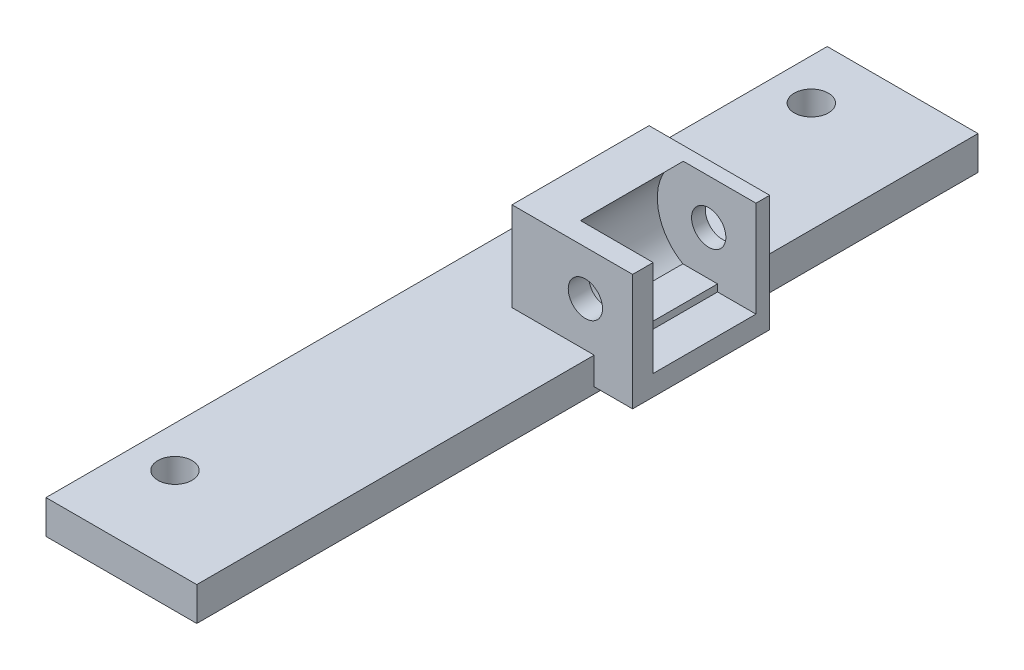
ISO-10303-21;
HEADER;
FILE_DESCRIPTION(('STEP AP214'),'2;1');
FILE_NAME('part.step','',(''),(''),'','','');
FILE_SCHEMA(('AUTOMOTIVE_DESIGN { 1 0 10303 214 1 1 1 1 }'));
ENDSEC;
DATA;
#1=APPLICATION_CONTEXT('core data for automotive mechanical design processes');
#2=APPLICATION_PROTOCOL_DEFINITION('international standard','automotive_design',2000,#1);
#3=PRODUCT_CONTEXT('',#1,'mechanical');
#4=PRODUCT('Part','Part','',(#3));
#5=PRODUCT_RELATED_PRODUCT_CATEGORY('part','',(#4));
#6=PRODUCT_DEFINITION_FORMATION('','',#4);
#7=PRODUCT_DEFINITION_CONTEXT('part definition',#1,'design');
#8=PRODUCT_DEFINITION('design','',#6,#7);
#9=PRODUCT_DEFINITION_SHAPE('','',#8);
#10=(LENGTH_UNIT() NAMED_UNIT(*) SI_UNIT(.MILLI.,.METRE.));
#11=(NAMED_UNIT(*) PLANE_ANGLE_UNIT() SI_UNIT($,.RADIAN.));
#12=(NAMED_UNIT(*) SI_UNIT($,.STERADIAN.) SOLID_ANGLE_UNIT());
#13=UNCERTAINTY_MEASURE_WITH_UNIT(LENGTH_MEASURE(1.E-05),#10,'distance_accuracy_value','');
#14=(GEOMETRIC_REPRESENTATION_CONTEXT(3) GLOBAL_UNCERTAINTY_ASSIGNED_CONTEXT((#13)) GLOBAL_UNIT_ASSIGNED_CONTEXT((#10,
#11,#12)) REPRESENTATION_CONTEXT('',''));
#15=CARTESIAN_POINT('',(0.,0.,0.));
#16=DIRECTION('',(0.,0.,1.));
#17=DIRECTION('',(1.,0.,0.));
#18=AXIS2_PLACEMENT_3D('',#15,#16,#17);
#19=CARTESIAN_POINT('',(-801.33832114316,105.685777143036,-21.59));
#20=DIRECTION('',(0.,0.,1.));
#21=DIRECTION('',(1.,0.,0.));
#22=AXIS2_PLACEMENT_3D('',#19,#20,#21);
#23=CYLINDRICAL_SURFACE('',#22,9.52500000000069);
#24=CARTESIAN_POINT('',(-801.33832114316,105.685777143036,0.));
#25=DIRECTION('',(0.,0.,1.));
#26=DIRECTION('',(1.,0.,0.));
#27=AXIS2_PLACEMENT_3D('',#24,#25,#26);
#28=CIRCLE('',#27,9.52500000000069);
#29=CARTESIAN_POINT('',(-806.134080607521,97.4561771430357,0.));
#30=VERTEX_POINT('',#29);
#31=CARTESIAN_POINT('',(-806.045825879217,113.966177143036,0.));
#32=VERTEX_POINT('',#31);
#33=EDGE_CURVE('E324',#30,#32,#28,.F.);
#34=ORIENTED_EDGE('',*,*,#33,.F.);
#35=DIRECTION('',(0.,0.,1.));
#36=VECTOR('',#35,1.);
#37=CARTESIAN_POINT('',(-806.134080607521,97.4561771430357,-21.59));
#38=LINE('',#37,#36);
#39=CARTESIAN_POINT('',(-806.134080607521,97.4561771430357,-19.05));
#40=VERTEX_POINT('',#39);
#41=EDGE_CURVE('E228',#30,#40,#38,.F.);
#42=ORIENTED_EDGE('',*,*,#41,.T.);
#43=CARTESIAN_POINT('',(-801.33832114316,105.685777143036,-19.05));
#44=DIRECTION('',(0.,0.,1.));
#45=DIRECTION('',(1.,0.,0.));
#46=AXIS2_PLACEMENT_3D('',#43,#44,#45);
#47=CIRCLE('',#46,9.52500000000069);
#48=CARTESIAN_POINT('',(-806.045825879217,113.966177143036,-19.05));
#49=VERTEX_POINT('',#48);
#50=EDGE_CURVE('E279',#49,#40,#47,.T.);
#51=ORIENTED_EDGE('',*,*,#50,.F.);
#52=DIRECTION('',(0.,0.,1.));
#53=VECTOR('',#52,1.);
#54=CARTESIAN_POINT('',(-806.045825879217,113.966177143036,-21.59));
#55=LINE('',#54,#53);
#56=EDGE_CURVE('E339',#49,#32,#55,.T.);
#57=ORIENTED_EDGE('',*,*,#56,.T.);
#58=EDGE_LOOP('',(#34,#42,#51,#57));
#59=FACE_BOUND('',#58,.T.);
#60=ADVANCED_FACE('F47',(#59),#23,.F.);
#61=CARTESIAN_POINT('',(-814.935825879218,0.,-21.59));
#62=DIRECTION('',(-1.,0.,0.));
#63=DIRECTION('',(0.,0.,1.));
#64=AXIS2_PLACEMENT_3D('',#61,#62,#63);
#65=PLANE('',#64);
#66=DIRECTION('',(0.,-1.,0.));
#67=VECTOR('',#66,1.);
#68=CARTESIAN_POINT('',(-814.935825879218,0.,-21.59));
#69=LINE('',#68,#67);
#70=CARTESIAN_POINT('',(-814.935825879218,113.966177143036,-21.59));
#71=VERTEX_POINT('',#70);
#72=CARTESIAN_POINT('',(-814.935825879218,97.4561771430357,-21.59));
#73=VERTEX_POINT('',#72);
#74=EDGE_CURVE('E328',#71,#73,#69,.T.);
#75=ORIENTED_EDGE('',*,*,#74,.T.);
#76=DIRECTION('',(0.,0.,1.));
#77=VECTOR('',#76,1.);
#78=CARTESIAN_POINT('',(-814.935825879218,97.4561771430357,-21.59));
#79=LINE('',#78,#77);
#80=CARTESIAN_POINT('',(-814.935825879218,97.4561771430357,3.81));
#81=VERTEX_POINT('',#80);
#82=EDGE_CURVE('E244',#73,#81,#79,.T.);
#83=ORIENTED_EDGE('',*,*,#82,.T.);
#84=DIRECTION('',(0.,-1.,0.));
#85=VECTOR('',#84,1.);
#86=CARTESIAN_POINT('',(-814.935825879218,92.3761771430357,3.81));
#87=LINE('',#86,#85);
#88=CARTESIAN_POINT('',(-814.935825879218,113.966177143036,3.81));
#89=VERTEX_POINT('',#88);
#90=EDGE_CURVE('E301',#89,#81,#87,.T.);
#91=ORIENTED_EDGE('',*,*,#90,.F.);
#92=DIRECTION('',(0.,0.,1.));
#93=VECTOR('',#92,1.);
#94=CARTESIAN_POINT('',(-814.935825879218,113.966177143036,-21.59));
#95=LINE('',#94,#93);
#96=EDGE_CURVE('E352',#71,#89,#95,.T.);
#97=ORIENTED_EDGE('',*,*,#96,.F.);
#98=EDGE_LOOP('',(#75,#83,#91,#97));
#99=FACE_BOUND('',#98,.T.);
#100=ADVANCED_FACE('F411',(#99),#65,.T.);
#101=CARTESIAN_POINT('',(0.,96.1607771430357,-21.59));
#102=DIRECTION('',(0.,1.,0.));
#103=DIRECTION('',(0.,0.,1.));
#104=AXIS2_PLACEMENT_3D('',#101,#102,#103);
#105=PLANE('',#104);
#106=DIRECTION('',(0.,0.,-1.));
#107=VECTOR('',#106,1.);
#108=CARTESIAN_POINT('',(-799.695825879218,96.1607771430357,-21.59));
#109=LINE('',#108,#107);
#110=CARTESIAN_POINT('',(-799.695825879218,96.1607771430357,0.));
#111=VERTEX_POINT('',#110);
#112=CARTESIAN_POINT('',(-799.695825879218,96.1607771430357,-19.05));
#113=VERTEX_POINT('',#112);
#114=EDGE_CURVE('E250',#111,#113,#109,.T.);
#115=ORIENTED_EDGE('',*,*,#114,.F.);
#116=DIRECTION('',(-1.,0.,0.));
#117=VECTOR('',#116,1.);
#118=CARTESIAN_POINT('',(0.,96.1607771430357,0.));
#119=LINE('',#118,#117);
#120=CARTESIAN_POINT('',(-792.583825879218,96.1607771430357,0.));
#121=VERTEX_POINT('',#120);
#122=EDGE_CURVE('E329',#121,#111,#119,.T.);
#123=ORIENTED_EDGE('',*,*,#122,.F.);
#124=DIRECTION('',(0.,0.,1.));
#125=VECTOR('',#124,1.);
#126=CARTESIAN_POINT('',(-792.583825879218,96.1607771430357,-21.59));
#127=LINE('',#126,#125);
#128=CARTESIAN_POINT('',(-792.583825879218,96.1607771430357,-19.05));
#129=VERTEX_POINT('',#128);
#130=EDGE_CURVE('E345',#129,#121,#127,.T.);
#131=ORIENTED_EDGE('',*,*,#130,.F.);
#132=DIRECTION('',(1.,0.,0.));
#133=VECTOR('',#132,1.);
#134=CARTESIAN_POINT('',(0.,96.1607771430357,-19.05));
#135=LINE('',#134,#133);
#136=EDGE_CURVE('E276',#113,#129,#135,.T.);
#137=ORIENTED_EDGE('',*,*,#136,.F.);
#138=EDGE_LOOP('',(#115,#123,#131,#137));
#139=FACE_BOUND('',#138,.T.);
#140=ADVANCED_FACE('F419',(#139),#105,.T.);
#141=CARTESIAN_POINT('',(-792.583825879218,0.,-21.59));
#142=DIRECTION('',(-1.,0.,0.));
#143=DIRECTION('',(0.,0.,1.));
#144=AXIS2_PLACEMENT_3D('',#141,#142,#143);
#145=PLANE('',#144);
#146=DIRECTION('',(0.,-1.,0.));
#147=VECTOR('',#146,1.);
#148=CARTESIAN_POINT('',(-792.583825879218,0.,-21.59));
#149=LINE('',#148,#147);
#150=CARTESIAN_POINT('',(-792.583825879218,113.966177143036,-21.59));
#151=VERTEX_POINT('',#150);
#152=CARTESIAN_POINT('',(-792.583825879218,92.3761771430357,-21.59));
#153=VERTEX_POINT('',#152);
#154=EDGE_CURVE('E335',#151,#153,#149,.T.);
#155=ORIENTED_EDGE('',*,*,#154,.F.);
#156=DIRECTION('',(0.,0.,-1.));
#157=VECTOR('',#156,1.);
#158=CARTESIAN_POINT('',(-792.583825879218,113.966177143036,6.46807626496399));
#159=LINE('',#158,#157);
#160=CARTESIAN_POINT('',(-792.583825879218,113.966177143036,-19.05));
#161=VERTEX_POINT('',#160);
#162=EDGE_CURVE('E265',#161,#151,#159,.T.);
#163=ORIENTED_EDGE('',*,*,#162,.F.);
#164=DIRECTION('',(0.,1.,0.));
#165=VECTOR('',#164,1.);
#166=CARTESIAN_POINT('',(-792.583825879218,0.,-19.05));
#167=LINE('',#166,#165);
#168=EDGE_CURVE('E270',#129,#161,#167,.T.);
#169=ORIENTED_EDGE('',*,*,#168,.F.);
#170=ORIENTED_EDGE('',*,*,#130,.T.);
#171=DIRECTION('',(0.,1.,0.));
#172=VECTOR('',#171,1.);
#173=CARTESIAN_POINT('',(-792.583825879218,92.3761771430357,0.));
#174=LINE('',#173,#172);
#175=CARTESIAN_POINT('',(-792.583825879218,113.966177143036,0.));
#176=VERTEX_POINT('',#175);
#177=EDGE_CURVE('E297',#121,#176,#174,.T.);
#178=ORIENTED_EDGE('',*,*,#177,.T.);
#179=DIRECTION('',(0.,0.,-1.));
#180=VECTOR('',#179,1.);
#181=CARTESIAN_POINT('',(-792.583825879218,113.966177143036,3.81));
#182=LINE('',#181,#180);
#183=CARTESIAN_POINT('',(-792.583825879218,113.966177143036,3.81));
#184=VERTEX_POINT('',#183);
#185=EDGE_CURVE('E315',#184,#176,#182,.T.);
#186=ORIENTED_EDGE('',*,*,#185,.F.);
#187=DIRECTION('',(0.,1.,0.));
#188=VECTOR('',#187,1.);
#189=CARTESIAN_POINT('',(-792.583825879218,92.3761771430357,3.81));
#190=LINE('',#189,#188);
#191=CARTESIAN_POINT('',(-792.583825879218,92.3761771430357,3.81));
#192=VERTEX_POINT('',#191);
#193=EDGE_CURVE('E308',#192,#184,#190,.T.);
#194=ORIENTED_EDGE('',*,*,#193,.F.);
#195=DIRECTION('',(0.,0.,1.));
#196=VECTOR('',#195,1.);
#197=CARTESIAN_POINT('',(-792.583825879218,92.3761771430357,-21.59));
#198=LINE('',#197,#196);
#199=EDGE_CURVE('E348',#153,#192,#198,.T.);
#200=ORIENTED_EDGE('',*,*,#199,.F.);
#201=EDGE_LOOP('',(#155,#163,#169,#170,#178,#186,#194,#200));
#202=FACE_BOUND('',#201,.T.);
#203=ADVANCED_FACE('F403',(#202),#145,.F.);
#204=CARTESIAN_POINT('',(0.,92.3761771430357,-21.59));
#205=DIRECTION('',(0.,-1.,0.));
#206=DIRECTION('',(0.,0.,-1.));
#207=AXIS2_PLACEMENT_3D('',#204,#205,#206);
#208=PLANE('',#207);
#209=DIRECTION('',(0.,0.,1.));
#210=VECTOR('',#209,1.);
#211=CARTESIAN_POINT('',(-799.695825879218,92.3761771430357,-21.59));
#212=LINE('',#211,#210);
#213=CARTESIAN_POINT('',(-799.695825879218,92.3761771430357,-21.59));
#214=VERTEX_POINT('',#213);
#215=CARTESIAN_POINT('',(-799.695825879218,92.3761771430357,3.81));
#216=VERTEX_POINT('',#215);
#217=EDGE_CURVE('E259',#214,#216,#212,.T.);
#218=ORIENTED_EDGE('',*,*,#217,.F.);
#219=DIRECTION('',(1.,0.,0.));
#220=VECTOR('',#219,1.);
#221=CARTESIAN_POINT('',(0.,92.3761771430357,-21.59));
#222=LINE('',#221,#220);
#223=EDGE_CURVE('E332',#214,#153,#222,.T.);
#224=ORIENTED_EDGE('',*,*,#223,.T.);
#225=ORIENTED_EDGE('',*,*,#199,.T.);
#226=DIRECTION('',(1.,0.,0.));
#227=VECTOR('',#226,1.);
#228=CARTESIAN_POINT('',(-814.935825879218,92.3761771430357,3.81));
#229=LINE('',#228,#227);
#230=EDGE_CURVE('E304',#216,#192,#229,.T.);
#231=ORIENTED_EDGE('',*,*,#230,.F.);
#232=EDGE_LOOP('',(#218,#224,#225,#231));
#233=FACE_BOUND('',#232,.T.);
#234=ADVANCED_FACE('F395',(#233),#208,.T.);
#235=CARTESIAN_POINT('',(0.,113.966177143036,-21.59));
#236=DIRECTION('',(0.,-1.,0.));
#237=DIRECTION('',(0.,0.,-1.));
#238=AXIS2_PLACEMENT_3D('',#235,#236,#237);
#239=PLANE('',#238);
#240=ORIENTED_EDGE('',*,*,#96,.T.);
#241=DIRECTION('',(-1.,0.,0.));
#242=VECTOR('',#241,1.);
#243=CARTESIAN_POINT('',(-814.935825879218,113.966177143036,3.81));
#244=LINE('',#243,#242);
#245=EDGE_CURVE('E311',#184,#89,#244,.T.);
#246=ORIENTED_EDGE('',*,*,#245,.F.);
#247=ORIENTED_EDGE('',*,*,#185,.T.);
#248=DIRECTION('',(-1.,0.,0.));
#249=VECTOR('',#248,1.);
#250=CARTESIAN_POINT('',(-814.935825879218,113.966177143036,0.));
#251=LINE('',#250,#249);
#252=EDGE_CURVE('E305',#176,#32,#251,.T.);
#253=ORIENTED_EDGE('',*,*,#252,.T.);
#254=ORIENTED_EDGE('',*,*,#56,.F.);
#255=DIRECTION('',(-1.,0.,0.));
#256=VECTOR('',#255,1.);
#257=CARTESIAN_POINT('',(0.,113.966177143036,-19.05));
#258=LINE('',#257,#256);
#259=EDGE_CURVE('E283',#161,#49,#258,.T.);
#260=ORIENTED_EDGE('',*,*,#259,.F.);
#261=ORIENTED_EDGE('',*,*,#162,.T.);
#262=DIRECTION('',(1.,0.,0.));
#263=VECTOR('',#262,1.);
#264=CARTESIAN_POINT('',(0.,113.966177143036,-21.59));
#265=LINE('',#264,#263);
#266=EDGE_CURVE('E325',#71,#151,#265,.T.);
#267=ORIENTED_EDGE('',*,*,#266,.F.);
#268=EDGE_LOOP('',(#240,#246,#247,#253,#254,#260,#261,#267));
#269=FACE_BOUND('',#268,.T.);
#270=ADVANCED_FACE('F413',(#269),#239,.F.);
#271=CARTESIAN_POINT('',(0.,0.,-21.59));
#272=DIRECTION('',(0.,0.,1.));
#273=DIRECTION('',(1.,0.,0.));
#274=AXIS2_PLACEMENT_3D('',#271,#272,#273);
#275=PLANE('',#274);
#276=ORIENTED_EDGE('',*,*,#223,.F.);
#277=DIRECTION('',(0.,1.,0.));
#278=VECTOR('',#277,1.);
#279=CARTESIAN_POINT('',(-799.695825879218,0.,-21.59));
#280=LINE('',#279,#278);
#281=CARTESIAN_POINT('',(-799.695825879218,97.4561771430357,-21.59));
#282=VERTEX_POINT('',#281);
#283=EDGE_CURVE('E62',#214,#282,#280,.T.);
#284=ORIENTED_EDGE('',*,*,#283,.T.);
#285=DIRECTION('',(1.,0.,0.));
#286=VECTOR('',#285,1.);
#287=CARTESIAN_POINT('',(0.,97.4561771430357,-21.59));
#288=LINE('',#287,#286);
#289=EDGE_CURVE('E66',#73,#282,#288,.T.);
#290=ORIENTED_EDGE('',*,*,#289,.F.);
#291=ORIENTED_EDGE('',*,*,#74,.F.);
#292=ORIENTED_EDGE('',*,*,#266,.T.);
#293=ORIENTED_EDGE('',*,*,#154,.T.);
#294=EDGE_LOOP('',(#276,#284,#290,#291,#292,#293));
#295=FACE_BOUND('',#294,.T.);
#296=CARTESIAN_POINT('',(-801.338321143161,105.685777143036,-21.59));
#297=DIRECTION('',(0.,0.,-1.));
#298=DIRECTION('',(-1.,0.,0.));
#299=AXIS2_PLACEMENT_3D('',#296,#297,#298);
#300=CIRCLE('',#299,3.17500000000008);
#301=CARTESIAN_POINT('',(-804.513321143161,105.685777143036,-21.59));
#302=VERTEX_POINT('',#301);
#303=EDGE_CURVE('E266',#302,#302,#300,.T.);
#304=ORIENTED_EDGE('',*,*,#303,.F.);
#305=EDGE_LOOP('',(#304));
#306=FACE_BOUND('',#305,.T.);
#307=ADVANCED_FACE('F396',(#295,#306),#275,.F.);
#308=CARTESIAN_POINT('',(0.,0.,3.81));
#309=DIRECTION('',(0.,0.,-1.));
#310=DIRECTION('',(-1.,0.,0.));
#311=AXIS2_PLACEMENT_3D('',#308,#309,#310);
#312=PLANE('',#311);
#313=DIRECTION('',(-1.,0.,0.));
#314=VECTOR('',#313,1.);
#315=CARTESIAN_POINT('',(0.,97.4561771430357,3.81));
#316=LINE('',#315,#314);
#317=CARTESIAN_POINT('',(-799.695825879218,97.4561771430357,3.81));
#318=VERTEX_POINT('',#317);
#319=EDGE_CURVE('E240',#318,#81,#316,.T.);
#320=ORIENTED_EDGE('',*,*,#319,.F.);
#321=DIRECTION('',(0.,-1.,0.));
#322=VECTOR('',#321,1.);
#323=CARTESIAN_POINT('',(-799.695825879218,0.,3.81));
#324=LINE('',#323,#322);
#325=EDGE_CURVE('E256',#318,#216,#324,.T.);
#326=ORIENTED_EDGE('',*,*,#325,.T.);
#327=ORIENTED_EDGE('',*,*,#230,.T.);
#328=ORIENTED_EDGE('',*,*,#193,.T.);
#329=ORIENTED_EDGE('',*,*,#245,.T.);
#330=ORIENTED_EDGE('',*,*,#90,.T.);
#331=EDGE_LOOP('',(#320,#326,#327,#328,#329,#330));
#332=FACE_BOUND('',#331,.T.);
#333=CARTESIAN_POINT('',(-801.33832114316,105.685777143036,3.81));
#334=DIRECTION('',(0.,0.,1.));
#335=DIRECTION('',(1.,0.,0.));
#336=AXIS2_PLACEMENT_3D('',#333,#334,#335);
#337=CIRCLE('',#336,3.17500000000008);
#338=CARTESIAN_POINT('',(-804.51332114316,105.685777143036,3.81));
#339=VERTEX_POINT('',#338);
#340=EDGE_CURVE('E293',#339,#339,#337,.T.);
#341=ORIENTED_EDGE('',*,*,#340,.F.);
#342=EDGE_LOOP('',(#341));
#343=FACE_BOUND('',#342,.T.);
#344=ADVANCED_FACE('F407',(#332,#343),#312,.F.);
#345=CARTESIAN_POINT('',(0.,0.,0.));
#346=DIRECTION('',(0.,0.,-1.));
#347=DIRECTION('',(-1.,0.,0.));
#348=AXIS2_PLACEMENT_3D('',#345,#346,#347);
#349=PLANE('',#348);
#350=DIRECTION('',(0.,-1.,0.));
#351=VECTOR('',#350,1.);
#352=CARTESIAN_POINT('',(-799.695825879218,0.,0.));
#353=LINE('',#352,#351);
#354=CARTESIAN_POINT('',(-799.695825879218,97.4561771430357,0.));
#355=VERTEX_POINT('',#354);
#356=EDGE_CURVE('E253',#355,#111,#353,.T.);
#357=ORIENTED_EDGE('',*,*,#356,.F.);
#358=DIRECTION('',(-1.,0.,0.));
#359=VECTOR('',#358,1.);
#360=CARTESIAN_POINT('',(0.,97.4561771430357,0.));
#361=LINE('',#360,#359);
#362=EDGE_CURVE('E236',#355,#30,#361,.T.);
#363=ORIENTED_EDGE('',*,*,#362,.T.);
#364=ORIENTED_EDGE('',*,*,#33,.T.);
#365=ORIENTED_EDGE('',*,*,#252,.F.);
#366=ORIENTED_EDGE('',*,*,#177,.F.);
#367=ORIENTED_EDGE('',*,*,#122,.T.);
#368=EDGE_LOOP('',(#357,#363,#364,#365,#366,#367));
#369=FACE_BOUND('',#368,.T.);
#370=CARTESIAN_POINT('',(-801.33832114316,105.685777143036,0.));
#371=DIRECTION('',(0.,0.,1.));
#372=DIRECTION('',(1.,0.,0.));
#373=AXIS2_PLACEMENT_3D('',#370,#371,#372);
#374=CIRCLE('',#373,3.17500000000008);
#375=CARTESIAN_POINT('',(-804.51332114316,105.685777143036,0.));
#376=VERTEX_POINT('',#375);
#377=EDGE_CURVE('E275',#376,#376,#374,.T.);
#378=ORIENTED_EDGE('',*,*,#377,.T.);
#379=EDGE_LOOP('',(#378));
#380=FACE_BOUND('',#379,.T.);
#381=ADVANCED_FACE('F373',(#369,#380),#349,.T.);
#382=CARTESIAN_POINT('',(-801.33832114316,105.685777143036,3.81));
#383=DIRECTION('',(0.,0.,-1.));
#384=DIRECTION('',(-1.,0.,0.));
#385=AXIS2_PLACEMENT_3D('',#382,#383,#384);
#386=CYLINDRICAL_SURFACE('',#385,3.17500000000008);
#387=CARTESIAN_POINT('',(-804.51332114316,105.685777143036,3.81));
#388=CARTESIAN_POINT('',(-804.51332114316,105.685777143036,3.7703125));
#389=CARTESIAN_POINT('',(-804.51332114316,105.685777143036,3.730625));
#390=CARTESIAN_POINT('',(-804.51332114316,105.685777143036,3.65125));
#391=CARTESIAN_POINT('',(-804.51332114316,105.685777143036,3.6115625));
#392=CARTESIAN_POINT('',(-804.51332114316,105.685777143036,3.5321875));
#393=CARTESIAN_POINT('',(-804.51332114316,105.685777143036,3.4925));
#394=CARTESIAN_POINT('',(-804.51332114316,105.685777143036,3.413125));
#395=CARTESIAN_POINT('',(-804.51332114316,105.685777143036,3.3734375));
#396=CARTESIAN_POINT('',(-804.51332114316,105.685777143036,3.2940625));
#397=CARTESIAN_POINT('',(-804.51332114316,105.685777143036,3.254375));
#398=CARTESIAN_POINT('',(-804.51332114316,105.685777143036,3.175));
#399=CARTESIAN_POINT('',(-804.51332114316,105.685777143036,3.1353125));
#400=CARTESIAN_POINT('',(-804.51332114316,105.685777143036,3.0559375));
#401=CARTESIAN_POINT('',(-804.51332114316,105.685777143036,3.01625));
#402=CARTESIAN_POINT('',(-804.51332114316,105.685777143036,2.936875));
#403=CARTESIAN_POINT('',(-804.51332114316,105.685777143036,2.8971875));
#404=CARTESIAN_POINT('',(-804.51332114316,105.685777143036,2.8178125));
#405=CARTESIAN_POINT('',(-804.51332114316,105.685777143036,2.778125));
#406=CARTESIAN_POINT('',(-804.51332114316,105.685777143036,2.69875));
#407=CARTESIAN_POINT('',(-804.51332114316,105.685777143036,2.6590625));
#408=CARTESIAN_POINT('',(-804.51332114316,105.685777143036,2.5796875));
#409=CARTESIAN_POINT('',(-804.51332114316,105.685777143036,2.54));
#410=CARTESIAN_POINT('',(-804.51332114316,105.685777143036,2.460625));
#411=CARTESIAN_POINT('',(-804.51332114316,105.685777143036,2.4209375));
#412=CARTESIAN_POINT('',(-804.51332114316,105.685777143036,2.3415625));
#413=CARTESIAN_POINT('',(-804.51332114316,105.685777143036,2.301875));
#414=CARTESIAN_POINT('',(-804.51332114316,105.685777143036,2.2225));
#415=CARTESIAN_POINT('',(-804.51332114316,105.685777143036,2.1828125));
#416=CARTESIAN_POINT('',(-804.51332114316,105.685777143036,2.1034375));
#417=CARTESIAN_POINT('',(-804.51332114316,105.685777143036,2.06375));
#418=CARTESIAN_POINT('',(-804.51332114316,105.685777143036,1.984375));
#419=CARTESIAN_POINT('',(-804.51332114316,105.685777143036,1.9446875));
#420=CARTESIAN_POINT('',(-804.51332114316,105.685777143036,1.8653125));
#421=CARTESIAN_POINT('',(-804.51332114316,105.685777143036,1.825625));
#422=CARTESIAN_POINT('',(-804.51332114316,105.685777143036,1.74625));
#423=CARTESIAN_POINT('',(-804.51332114316,105.685777143036,1.7065625));
#424=CARTESIAN_POINT('',(-804.51332114316,105.685777143036,1.6271875));
#425=CARTESIAN_POINT('',(-804.51332114316,105.685777143036,1.5875));
#426=CARTESIAN_POINT('',(-804.51332114316,105.685777143036,1.508125));
#427=CARTESIAN_POINT('',(-804.51332114316,105.685777143036,1.4684375));
#428=CARTESIAN_POINT('',(-804.51332114316,105.685777143036,1.3890625));
#429=CARTESIAN_POINT('',(-804.51332114316,105.685777143036,1.349375));
#430=CARTESIAN_POINT('',(-804.51332114316,105.685777143036,1.27));
#431=CARTESIAN_POINT('',(-804.51332114316,105.685777143036,1.2303125));
#432=CARTESIAN_POINT('',(-804.51332114316,105.685777143036,1.1509375));
#433=CARTESIAN_POINT('',(-804.51332114316,105.685777143036,1.11125));
#434=CARTESIAN_POINT('',(-804.51332114316,105.685777143036,1.031875));
#435=CARTESIAN_POINT('',(-804.51332114316,105.685777143036,0.9921875));
#436=CARTESIAN_POINT('',(-804.51332114316,105.685777143036,0.9128125));
#437=CARTESIAN_POINT('',(-804.51332114316,105.685777143036,0.873125));
#438=CARTESIAN_POINT('',(-804.51332114316,105.685777143036,0.79375));
#439=CARTESIAN_POINT('',(-804.51332114316,105.685777143036,0.7540625));
#440=CARTESIAN_POINT('',(-804.51332114316,105.685777143036,0.6746875));
#441=CARTESIAN_POINT('',(-804.51332114316,105.685777143036,0.635));
#442=CARTESIAN_POINT('',(-804.51332114316,105.685777143036,0.555625));
#443=CARTESIAN_POINT('',(-804.51332114316,105.685777143036,0.5159375));
#444=CARTESIAN_POINT('',(-804.51332114316,105.685777143036,0.4365625));
#445=CARTESIAN_POINT('',(-804.51332114316,105.685777143036,0.396875));
#446=CARTESIAN_POINT('',(-804.51332114316,105.685777143036,0.3175));
#447=CARTESIAN_POINT('',(-804.51332114316,105.685777143036,0.2778125));
#448=CARTESIAN_POINT('',(-804.51332114316,105.685777143036,0.1984375));
#449=CARTESIAN_POINT('',(-804.51332114316,105.685777143036,0.15875));
#450=CARTESIAN_POINT('',(-804.51332114316,105.685777143036,0.0793749999999999));
#451=CARTESIAN_POINT('',(-804.51332114316,105.685777143036,0.0396874999999999));
#452=CARTESIAN_POINT('',(-804.51332114316,105.685777143036,0.));
#453=B_SPLINE_CURVE_WITH_KNOTS('',3,(#387,#388,#389,#390,#391,#392,#393,#394,#395,#396,#397,
#398,#399,#400,#401,#402,#403,#404,#405,#406,#407,#408,#409,#410,#411,#412,#413,#414,#415,#416,
#417,#418,#419,#420,#421,#422,#423,#424,#425,#426,#427,#428,#429,#430,#431,#432,#433,#434,#435,
#436,#437,#438,#439,#440,#441,#442,#443,#444,#445,#446,#447,#448,#449,#450,#451,#452),
.UNSPECIFIED.,.F.,.F.,(4,2,2,2,2,2,2,2,2,2,2,2,2,2,2,2,2,2,2,2,2,2,2,2,2,2,2,2,2,2,2,2,4),(0.,
0.1190625,0.238125,0.3571875,0.47625,0.595312499999999,0.714375,0.833437499999999,
0.952499999999999,1.0715625,1.190625,1.3096875,1.42875,1.5478125,1.666875,1.7859375,1.905,
2.0240625,2.143125,2.2621875,2.38125,2.5003125,2.619375,2.7384375,2.8575,2.9765625,3.095625,
3.2146875,3.33375,3.4528125,3.571875,3.6909375,3.81),.UNSPECIFIED.);
#454=EDGE_CURVE('BSEAM459',#339,#376,#453,.T.);
#455=ORIENTED_EDGE('',*,*,#340,.T.);
#456=ORIENTED_EDGE('',*,*,#377,.F.);
#457=ORIENTED_EDGE('',*,*,#454,.T.);
#458=ORIENTED_EDGE('',*,*,#454,.F.);
#459=EDGE_LOOP('',(#455,#457,#456,#458));
#460=FACE_BOUND('',#459,.T.);
#461=ADVANCED_FACE('F459',(#460),#386,.F.);
#462=CARTESIAN_POINT('',(-801.338321143161,105.685777143036,6.46807626496399));
#463=DIRECTION('',(0.,0.,-1.));
#464=DIRECTION('',(-1.,0.,0.));
#465=AXIS2_PLACEMENT_3D('',#462,#463,#464);
#466=CYLINDRICAL_SURFACE('',#465,3.17500000000008);
#467=ORIENTED_EDGE('',*,*,#303,.T.);
#468=EDGE_LOOP('',(#467));
#469=FACE_BOUND('',#468,.T.);
#470=CARTESIAN_POINT('',(-801.338321143161,105.685777143036,-19.05));
#471=DIRECTION('',(0.,0.,1.));
#472=DIRECTION('',(1.,0.,0.));
#473=AXIS2_PLACEMENT_3D('',#470,#471,#472);
#474=CIRCLE('',#473,3.17500000000008);
#475=CARTESIAN_POINT('',(-798.163321143161,105.685777143036,-19.05));
#476=VERTEX_POINT('',#475);
#477=EDGE_CURVE('E271',#476,#476,#474,.F.);
#478=ORIENTED_EDGE('',*,*,#477,.F.);
#479=EDGE_LOOP('',(#478));
#480=FACE_BOUND('',#479,.T.);
#481=ADVANCED_FACE('F438',(#469,#480),#466,.F.);
#482=CARTESIAN_POINT('',(-801.33832114316,97.4053771430357,-19.05));
#483=DIRECTION('',(0.,0.,1.));
#484=DIRECTION('',(1.,0.,0.));
#485=AXIS2_PLACEMENT_3D('',#482,#483,#484);
#486=PLANE('',#485);
#487=DIRECTION('',(0.,1.,0.));
#488=VECTOR('',#487,1.);
#489=CARTESIAN_POINT('',(-799.695825879218,97.4053771430357,-19.05));
#490=LINE('',#489,#488);
#491=CARTESIAN_POINT('',(-799.695825879218,97.4561771430357,-19.05));
#492=VERTEX_POINT('',#491);
#493=EDGE_CURVE('E11',#113,#492,#490,.T.);
#494=ORIENTED_EDGE('',*,*,#493,.F.);
#495=ORIENTED_EDGE('',*,*,#136,.T.);
#496=ORIENTED_EDGE('',*,*,#168,.T.);
#497=ORIENTED_EDGE('',*,*,#259,.T.);
#498=ORIENTED_EDGE('',*,*,#50,.T.);
#499=DIRECTION('',(1.,0.,0.));
#500=VECTOR('',#499,1.);
#501=CARTESIAN_POINT('',(-801.33832114316,97.4561771430357,-19.05));
#502=LINE('',#501,#500);
#503=EDGE_CURVE('E55',#40,#492,#502,.T.);
#504=ORIENTED_EDGE('',*,*,#503,.T.);
#505=EDGE_LOOP('',(#494,#495,#496,#497,#498,#504));
#506=FACE_BOUND('',#505,.T.);
#507=ORIENTED_EDGE('',*,*,#477,.T.);
#508=EDGE_LOOP('',(#507));
#509=FACE_BOUND('',#508,.T.);
#510=ADVANCED_FACE('F361',(#506,#509),#486,.T.);
#511=CARTESIAN_POINT('',(0.,97.4561771430357,0.));
#512=DIRECTION('',(0.,-1.,0.));
#513=DIRECTION('',(0.,0.,-1.));
#514=AXIS2_PLACEMENT_3D('',#511,#512,#513);
#515=PLANE('',#514);
#516=ORIENTED_EDGE('',*,*,#362,.F.);
#517=DIRECTION('',(0.,0.,1.));
#518=VECTOR('',#517,1.);
#519=CARTESIAN_POINT('',(-799.695825879218,97.4561771430357,-67.31));
#520=LINE('',#519,#518);
#521=EDGE_CURVE('E215',#492,#355,#520,.T.);
#522=ORIENTED_EDGE('',*,*,#521,.F.);
#523=ORIENTED_EDGE('',*,*,#503,.F.);
#524=ORIENTED_EDGE('',*,*,#41,.F.);
#525=EDGE_LOOP('',(#516,#522,#523,#524));
#526=FACE_BOUND('',#525,.T.);
#527=ADVANCED_FACE('F365',(#526),#515,.F.);
#528=CARTESIAN_POINT('',(-799.695825879218,97.4561771430357,-67.31));
#529=DIRECTION('',(1.,0.,0.));
#530=DIRECTION('',(0.,0.,-1.));
#531=AXIS2_PLACEMENT_3D('',#528,#529,#530);
#532=PLANE('',#531);
#533=ORIENTED_EDGE('',*,*,#521,.T.);
#534=ORIENTED_EDGE('',*,*,#356,.T.);
#535=ORIENTED_EDGE('',*,*,#114,.T.);
#536=ORIENTED_EDGE('',*,*,#493,.T.);
#537=EDGE_LOOP('',(#533,#534,#535,#536));
#538=FACE_BOUND('',#537,.T.);
#539=ADVANCED_FACE('F377',(#538),#532,.T.);
#540=ORIENTED_EDGE('',*,*,#283,.F.);
#541=ORIENTED_EDGE('',*,*,#217,.T.);
#542=ORIENTED_EDGE('',*,*,#325,.F.);
#543=CARTESIAN_POINT('',(-799.695825879218,97.4561771430357,77.47));
#544=VERTEX_POINT('',#543);
#545=EDGE_CURVE('E210',#318,#544,#520,.T.);
#546=ORIENTED_EDGE('',*,*,#545,.T.);
#547=DIRECTION('',(0.,-1.,0.));
#548=VECTOR('',#547,1.);
#549=CARTESIAN_POINT('',(-799.695825879218,97.4561771430357,77.47));
#550=LINE('',#549,#548);
#551=CARTESIAN_POINT('',(-799.695825879218,91.2114000000002,77.47));
#552=VERTEX_POINT('',#551);
#553=EDGE_CURVE('E173',#544,#552,#550,.T.);
#554=ORIENTED_EDGE('',*,*,#553,.T.);
#555=DIRECTION('',(0.,0.,-1.));
#556=VECTOR('',#555,1.);
#557=CARTESIAN_POINT('',(-799.695825879218,91.2114000000002,-67.31));
#558=LINE('',#557,#556);
#559=CARTESIAN_POINT('',(-799.695825879218,91.2114000000002,-67.31));
#560=VERTEX_POINT('',#559);
#561=EDGE_CURVE('E183',#552,#560,#558,.T.);
#562=ORIENTED_EDGE('',*,*,#561,.T.);
#563=DIRECTION('',(0.,-1.,0.));
#564=VECTOR('',#563,1.);
#565=CARTESIAN_POINT('',(-799.695825879218,97.4561771430357,-67.31));
#566=LINE('',#565,#564);
#567=CARTESIAN_POINT('',(-799.695825879218,97.4561771430357,-67.31));
#568=VERTEX_POINT('',#567);
#569=EDGE_CURVE('E225',#568,#560,#566,.T.);
#570=ORIENTED_EDGE('',*,*,#569,.F.);
#571=EDGE_CURVE('E211',#568,#282,#520,.T.);
#572=ORIENTED_EDGE('',*,*,#571,.T.);
#573=EDGE_LOOP('',(#540,#541,#542,#546,#554,#562,#570,#572));
#574=FACE_BOUND('',#573,.T.);
#575=ADVANCED_FACE('F384',(#574),#532,.T.);
#576=CARTESIAN_POINT('',(-820.038999999999,97.4561771430357,61.1628571428577));
#577=DIRECTION('',(0.,-1.,0.));
#578=DIRECTION('',(0.,0.,-1.));
#579=AXIS2_PLACEMENT_3D('',#576,#577,#578);
#580=CIRCLE('',#579,3.1750000000002);
#581=CARTESIAN_POINT('',(-820.038999999999,97.4561771430357,57.9878571428575));
#582=VERTEX_POINT('',#581);
#583=EDGE_CURVE('E199',#582,#582,#580,.T.);
#584=ORIENTED_EDGE('',*,*,#583,.T.);
#585=EDGE_LOOP('',(#584));
#586=FACE_BOUND('',#585,.T.);
#587=CARTESIAN_POINT('',(-820.039,97.4561771430357,-56.7657142857138));
#588=DIRECTION('',(0.,-1.,0.));
#589=DIRECTION('',(0.,0.,-1.));
#590=AXIS2_PLACEMENT_3D('',#587,#588,#589);
#591=CIRCLE('',#590,3.17500000000008);
#592=CARTESIAN_POINT('',(-820.039,97.4561771430357,-59.9407142857139));
#593=VERTEX_POINT('',#592);
#594=EDGE_CURVE('E206',#593,#593,#591,.T.);
#595=ORIENTED_EDGE('',*,*,#594,.T.);
#596=EDGE_LOOP('',(#595));
#597=FACE_BOUND('',#596,.T.);
#598=ORIENTED_EDGE('',*,*,#82,.F.);
#599=ORIENTED_EDGE('',*,*,#289,.T.);
#600=ORIENTED_EDGE('',*,*,#571,.F.);
#601=DIRECTION('',(1.,0.,0.));
#602=VECTOR('',#601,1.);
#603=CARTESIAN_POINT('',(-799.695825879218,97.4561771430357,-67.31));
#604=LINE('',#603,#602);
#605=CARTESIAN_POINT('',(-827.635825879218,97.4561771430357,-67.31));
#606=VERTEX_POINT('',#605);
#607=EDGE_CURVE('E221',#606,#568,#604,.T.);
#608=ORIENTED_EDGE('',*,*,#607,.F.);
#609=DIRECTION('',(0.,0.,-1.));
#610=VECTOR('',#609,1.);
#611=CARTESIAN_POINT('',(-827.635825879218,97.4561771430357,-67.31));
#612=LINE('',#611,#610);
#613=CARTESIAN_POINT('',(-827.635825879218,97.4561771430357,77.47));
#614=VERTEX_POINT('',#613);
#615=EDGE_CURVE('E218',#614,#606,#612,.T.);
#616=ORIENTED_EDGE('',*,*,#615,.F.);
#617=DIRECTION('',(-1.,0.,0.));
#618=VECTOR('',#617,1.);
#619=CARTESIAN_POINT('',(-799.695825879218,97.4561771430357,77.47));
#620=LINE('',#619,#618);
#621=EDGE_CURVE('E166',#544,#614,#620,.T.);
#622=ORIENTED_EDGE('',*,*,#621,.F.);
#623=ORIENTED_EDGE('',*,*,#545,.F.);
#624=ORIENTED_EDGE('',*,*,#319,.T.);
#625=EDGE_LOOP('',(#598,#599,#600,#608,#616,#622,#623,#624));
#626=FACE_BOUND('',#625,.T.);
#627=ADVANCED_FACE('F387',(#586,#597,#626),#515,.F.);
#628=CARTESIAN_POINT('',(-799.695825879218,97.4561771430357,-67.31));
#629=DIRECTION('',(0.,0.,-1.));
#630=DIRECTION('',(-1.,0.,0.));
#631=AXIS2_PLACEMENT_3D('',#628,#629,#630);
#632=PLANE('',#631);
#633=ORIENTED_EDGE('',*,*,#569,.T.);
#634=DIRECTION('',(-1.,0.,0.));
#635=VECTOR('',#634,1.);
#636=CARTESIAN_POINT('',(-799.695825879218,91.2114000000002,-67.31));
#637=LINE('',#636,#635);
#638=CARTESIAN_POINT('',(-827.635825879218,91.2114000000002,-67.31));
#639=VERTEX_POINT('',#638);
#640=EDGE_CURVE('E188',#560,#639,#637,.T.);
#641=ORIENTED_EDGE('',*,*,#640,.T.);
#642=DIRECTION('',(0.,-1.,0.));
#643=VECTOR('',#642,1.);
#644=CARTESIAN_POINT('',(-827.635825879218,97.4561771430357,-67.31));
#645=LINE('',#644,#643);
#646=EDGE_CURVE('E172',#606,#639,#645,.T.);
#647=ORIENTED_EDGE('',*,*,#646,.F.);
#648=ORIENTED_EDGE('',*,*,#607,.T.);
#649=EDGE_LOOP('',(#633,#641,#647,#648));
#650=FACE_BOUND('',#649,.T.);
#651=ADVANCED_FACE('F391',(#650),#632,.T.);
#652=CARTESIAN_POINT('',(-827.635825879218,97.4561771430357,-67.31));
#653=DIRECTION('',(-1.,0.,0.));
#654=DIRECTION('',(0.,0.,1.));
#655=AXIS2_PLACEMENT_3D('',#652,#653,#654);
#656=PLANE('',#655);
#657=ORIENTED_EDGE('',*,*,#646,.T.);
#658=DIRECTION('',(0.,0.,1.));
#659=VECTOR('',#658,1.);
#660=CARTESIAN_POINT('',(-827.635825879218,91.2114000000002,-67.31));
#661=LINE('',#660,#659);
#662=CARTESIAN_POINT('',(-827.635825879218,91.2114000000002,77.47));
#663=VERTEX_POINT('',#662);
#664=EDGE_CURVE('E180',#639,#663,#661,.T.);
#665=ORIENTED_EDGE('',*,*,#664,.T.);
#666=DIRECTION('',(0.,-1.,0.));
#667=VECTOR('',#666,1.);
#668=CARTESIAN_POINT('',(-827.635825879218,97.4561771430357,77.47));
#669=LINE('',#668,#667);
#670=EDGE_CURVE('E160',#614,#663,#669,.T.);
#671=ORIENTED_EDGE('',*,*,#670,.F.);
#672=ORIENTED_EDGE('',*,*,#615,.T.);
#673=EDGE_LOOP('',(#657,#665,#671,#672));
#674=FACE_BOUND('',#673,.T.);
#675=ADVANCED_FACE('F186',(#674),#656,.T.);
#676=CARTESIAN_POINT('',(-799.695825879218,97.4561771430357,77.47));
#677=DIRECTION('',(0.,0.,1.));
#678=DIRECTION('',(1.,0.,0.));
#679=AXIS2_PLACEMENT_3D('',#676,#677,#678);
#680=PLANE('',#679);
#681=ORIENTED_EDGE('',*,*,#670,.T.);
#682=DIRECTION('',(1.,0.,0.));
#683=VECTOR('',#682,1.);
#684=CARTESIAN_POINT('',(-799.695825879218,91.2114000000002,77.47));
#685=LINE('',#684,#683);
#686=EDGE_CURVE('E164',#663,#552,#685,.T.);
#687=ORIENTED_EDGE('',*,*,#686,.T.);
#688=ORIENTED_EDGE('',*,*,#553,.F.);
#689=ORIENTED_EDGE('',*,*,#621,.T.);
#690=EDGE_LOOP('',(#681,#687,#688,#689));
#691=FACE_BOUND('',#690,.T.);
#692=ADVANCED_FACE('F162',(#691),#680,.T.);
#693=CARTESIAN_POINT('',(-820.039,97.4561771430357,-56.7657142857138));
#694=DIRECTION('',(0.,-1.,0.));
#695=DIRECTION('',(0.,0.,-1.));
#696=AXIS2_PLACEMENT_3D('',#693,#694,#695);
#697=CYLINDRICAL_SURFACE('',#696,3.17500000000008);
#698=ORIENTED_EDGE('',*,*,#594,.F.);
#699=EDGE_LOOP('',(#698));
#700=FACE_BOUND('',#699,.T.);
#701=CARTESIAN_POINT('',(-820.039,91.2114000000002,-56.7657142857138));
#702=DIRECTION('',(0.,1.,0.));
#703=DIRECTION('',(0.,0.,1.));
#704=AXIS2_PLACEMENT_3D('',#701,#702,#703);
#705=CIRCLE('',#704,3.17500000000008);
#706=CARTESIAN_POINT('',(-820.039,91.2114000000002,-53.5907142857137));
#707=VERTEX_POINT('',#706);
#708=EDGE_CURVE('E195',#707,#707,#705,.T.);
#709=ORIENTED_EDGE('',*,*,#708,.F.);
#710=EDGE_LOOP('',(#709));
#711=FACE_BOUND('',#710,.T.);
#712=ADVANCED_FACE('F579',(#700,#711),#697,.F.);
#713=CARTESIAN_POINT('',(-820.038999999999,97.4561771430357,61.1628571428577));
#714=DIRECTION('',(0.,-1.,0.));
#715=DIRECTION('',(0.,0.,-1.));
#716=AXIS2_PLACEMENT_3D('',#713,#714,#715);
#717=CYLINDRICAL_SURFACE('',#716,3.1750000000002);
#718=ORIENTED_EDGE('',*,*,#583,.F.);
#719=EDGE_LOOP('',(#718));
#720=FACE_BOUND('',#719,.T.);
#721=CARTESIAN_POINT('',(-820.038999999999,91.2114000000002,61.1628571428577));
#722=DIRECTION('',(0.,1.,0.));
#723=DIRECTION('',(0.,0.,1.));
#724=AXIS2_PLACEMENT_3D('',#721,#722,#723);
#725=CIRCLE('',#724,3.1750000000002);
#726=CARTESIAN_POINT('',(-820.038999999999,91.2114000000002,64.3378571428579));
#727=VERTEX_POINT('',#726);
#728=EDGE_CURVE('E191',#727,#727,#725,.T.);
#729=ORIENTED_EDGE('',*,*,#728,.F.);
#730=EDGE_LOOP('',(#729));
#731=FACE_BOUND('',#730,.T.);
#732=ADVANCED_FACE('F587',(#720,#731),#717,.F.);
#733=CARTESIAN_POINT('',(-820.038999999999,91.2114000000002,61.1628571428577));
#734=DIRECTION('',(0.,1.,0.));
#735=DIRECTION('',(1.,0.,0.));
#736=AXIS2_PLACEMENT_3D('',#733,#734,#735);
#737=PLANE('',#736);
#738=ORIENTED_EDGE('',*,*,#728,.T.);
#739=EDGE_LOOP('',(#738));
#740=FACE_BOUND('',#739,.T.);
#741=ORIENTED_EDGE('',*,*,#708,.T.);
#742=EDGE_LOOP('',(#741));
#743=FACE_BOUND('',#742,.T.);
#744=ORIENTED_EDGE('',*,*,#686,.F.);
#745=ORIENTED_EDGE('',*,*,#664,.F.);
#746=ORIENTED_EDGE('',*,*,#640,.F.);
#747=ORIENTED_EDGE('',*,*,#561,.F.);
#748=EDGE_LOOP('',(#744,#745,#746,#747));
#749=FACE_BOUND('',#748,.T.);
#750=ADVANCED_FACE('F178',(#740,#743,#749),#737,.F.);
#751=CLOSED_SHELL('',(#60,#100,#140,#203,#234,#270,#307,#344,#381,#461,#481,#510,#527,#539,#575,
#627,#651,#675,#692,#712,#732,#750));
#752=MANIFOLD_SOLID_BREP('B2',#751);
#753=ADVANCED_BREP_SHAPE_REPRESENTATION('',(#18,#752),#14);
#754=SHAPE_DEFINITION_REPRESENTATION(#9,#753);
ENDSEC;
END-ISO-10303-21;
